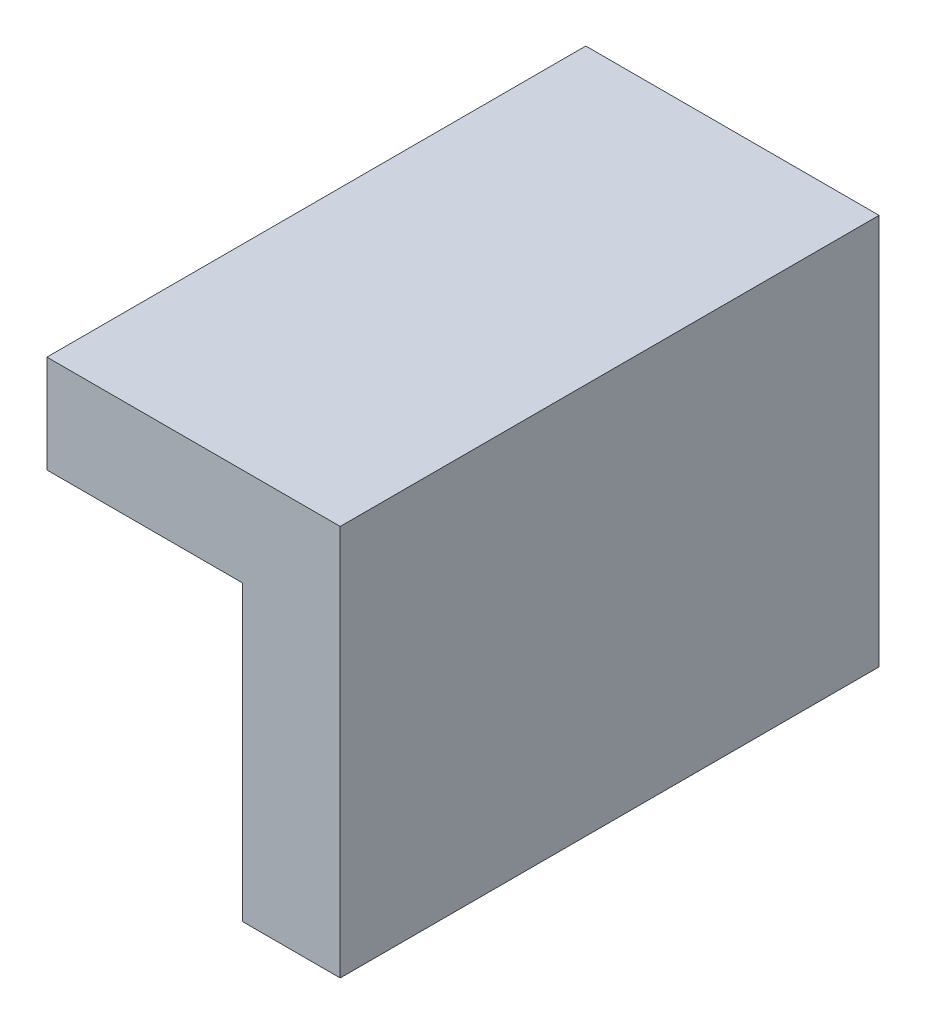
ISO-10303-21;
HEADER;
FILE_DESCRIPTION(('STEP AP214'),'2;1');
FILE_NAME('part.step','',(''),(''),'','','');
FILE_SCHEMA(('AUTOMOTIVE_DESIGN { 1 0 10303 214 1 1 1 1 }'));
ENDSEC;
DATA;
#1=APPLICATION_CONTEXT('core data for automotive mechanical design processes');
#2=APPLICATION_PROTOCOL_DEFINITION('international standard','automotive_design',2000,#1);
#3=PRODUCT_CONTEXT('',#1,'mechanical');
#4=PRODUCT('Part','Part','',(#3));
#5=PRODUCT_RELATED_PRODUCT_CATEGORY('part','',(#4));
#6=PRODUCT_DEFINITION_FORMATION('','',#4);
#7=PRODUCT_DEFINITION_CONTEXT('part definition',#1,'design');
#8=PRODUCT_DEFINITION('design','',#6,#7);
#9=PRODUCT_DEFINITION_SHAPE('','',#8);
#10=(LENGTH_UNIT() NAMED_UNIT(*) SI_UNIT(.MILLI.,.METRE.));
#11=(NAMED_UNIT(*) PLANE_ANGLE_UNIT() SI_UNIT($,.RADIAN.));
#12=(NAMED_UNIT(*) SI_UNIT($,.STERADIAN.) SOLID_ANGLE_UNIT());
#13=UNCERTAINTY_MEASURE_WITH_UNIT(LENGTH_MEASURE(1.E-05),#10,'distance_accuracy_value','');
#14=(GEOMETRIC_REPRESENTATION_CONTEXT(3) GLOBAL_UNCERTAINTY_ASSIGNED_CONTEXT((#13)) GLOBAL_UNIT_ASSIGNED_CONTEXT((#10,
#11,#12)) REPRESENTATION_CONTEXT('',''));
#15=CARTESIAN_POINT('',(0.,0.,0.));
#16=DIRECTION('',(0.,0.,1.));
#17=DIRECTION('',(1.,0.,0.));
#18=AXIS2_PLACEMENT_3D('',#15,#16,#17);
#19=CARTESIAN_POINT('',(55.,-25.4,12.7));
#20=DIRECTION('',(-1.,0.,0.));
#21=DIRECTION('',(0.,-1.,0.));
#22=AXIS2_PLACEMENT_3D('',#19,#20,#21);
#23=PLANE('',#22);
#24=DIRECTION('',(0.,-1.,0.));
#25=VECTOR('',#24,1.);
#26=CARTESIAN_POINT('',(55.,-25.4,0.));
#27=LINE('',#26,#25);
#28=CARTESIAN_POINT('',(55.,194.6,0.));
#29=VERTEX_POINT('',#28);
#30=CARTESIAN_POINT('',(55.,143.8,0.));
#31=VERTEX_POINT('',#30);
#32=EDGE_CURVE('E110',#29,#31,#27,.T.);
#33=ORIENTED_EDGE('',*,*,#32,.T.);
#34=DIRECTION('',(0.,0.,1.));
#35=VECTOR('',#34,1.);
#36=CARTESIAN_POINT('',(55.,143.8,-70.));
#37=LINE('',#36,#35);
#38=CARTESIAN_POINT('',(55.,143.8,-70.));
#39=VERTEX_POINT('',#38);
#40=EDGE_CURVE('E95',#39,#31,#37,.T.);
#41=ORIENTED_EDGE('',*,*,#40,.F.);
#42=DIRECTION('',(0.,-1.,0.));
#43=VECTOR('',#42,1.);
#44=CARTESIAN_POINT('',(55.,0.,-70.));
#45=LINE('',#44,#43);
#46=CARTESIAN_POINT('',(55.,194.6,-70.));
#47=VERTEX_POINT('',#46);
#48=EDGE_CURVE('E134',#47,#39,#45,.T.);
#49=ORIENTED_EDGE('',*,*,#48,.F.);
#50=DIRECTION('',(0.,0.,1.));
#51=VECTOR('',#50,1.);
#52=CARTESIAN_POINT('',(55.,194.6,-12.7));
#53=LINE('',#52,#51);
#54=EDGE_CURVE('E111',#47,#29,#53,.T.);
#55=ORIENTED_EDGE('',*,*,#54,.T.);
#56=EDGE_LOOP('',(#33,#41,#49,#55));
#57=FACE_BOUND('',#56,.T.);
#58=ADVANCED_FACE('F35',(#57),#23,.F.);
#59=CARTESIAN_POINT('',(0.,0.,0.));
#60=DIRECTION('',(0.,0.,1.));
#61=DIRECTION('',(1.,0.,0.));
#62=AXIS2_PLACEMENT_3D('',#59,#60,#61);
#63=PLANE('',#62);
#64=DIRECTION('',(-1.,0.,0.));
#65=VECTOR('',#64,1.);
#66=CARTESIAN_POINT('',(0.,143.8,0.));
#67=LINE('',#66,#65);
#68=CARTESIAN_POINT('',(42.3,143.8,0.));
#69=VERTEX_POINT('',#68);
#70=EDGE_CURVE('E11',#31,#69,#67,.T.);
#71=ORIENTED_EDGE('',*,*,#70,.F.);
#72=ORIENTED_EDGE('',*,*,#32,.F.);
#73=DIRECTION('',(1.,0.,0.));
#74=VECTOR('',#73,1.);
#75=CARTESIAN_POINT('',(55.,194.6,0.));
#76=LINE('',#75,#74);
#77=CARTESIAN_POINT('',(16.9,194.6,0.));
#78=VERTEX_POINT('',#77);
#79=EDGE_CURVE('E49',#78,#29,#76,.T.);
#80=ORIENTED_EDGE('',*,*,#79,.F.);
#81=DIRECTION('',(0.,1.,0.));
#82=VECTOR('',#81,1.);
#83=CARTESIAN_POINT('',(16.9,0.,0.));
#84=LINE('',#83,#82);
#85=CARTESIAN_POINT('',(16.9,181.9,0.));
#86=VERTEX_POINT('',#85);
#87=EDGE_CURVE('E98',#86,#78,#84,.T.);
#88=ORIENTED_EDGE('',*,*,#87,.F.);
#89=DIRECTION('',(-1.,0.,0.));
#90=VECTOR('',#89,1.);
#91=CARTESIAN_POINT('',(0.,181.9,0.));
#92=LINE('',#91,#90);
#93=CARTESIAN_POINT('',(42.3,181.9,0.));
#94=VERTEX_POINT('',#93);
#95=EDGE_CURVE('E113',#94,#86,#92,.T.);
#96=ORIENTED_EDGE('',*,*,#95,.F.);
#97=DIRECTION('',(0.,1.,0.));
#98=VECTOR('',#97,1.);
#99=CARTESIAN_POINT('',(42.3,0.,0.));
#100=LINE('',#99,#98);
#101=EDGE_CURVE('E42',#69,#94,#100,.T.);
#102=ORIENTED_EDGE('',*,*,#101,.F.);
#103=EDGE_LOOP('',(#71,#72,#80,#88,#96,#102));
#104=FACE_BOUND('',#103,.T.);
#105=ADVANCED_FACE('F108',(#104),#63,.T.);
#106=CARTESIAN_POINT('',(55.,194.6,-12.7));
#107=DIRECTION('',(0.,-1.,0.));
#108=DIRECTION('',(0.,0.,-1.));
#109=AXIS2_PLACEMENT_3D('',#106,#107,#108);
#110=PLANE('',#109);
#111=DIRECTION('',(0.,0.,1.));
#112=VECTOR('',#111,1.);
#113=CARTESIAN_POINT('',(16.9,194.6,-70.));
#114=LINE('',#113,#112);
#115=CARTESIAN_POINT('',(16.9,194.6,-70.));
#116=VERTEX_POINT('',#115);
#117=EDGE_CURVE('E86',#116,#78,#114,.T.);
#118=ORIENTED_EDGE('',*,*,#117,.T.);
#119=ORIENTED_EDGE('',*,*,#79,.T.);
#120=ORIENTED_EDGE('',*,*,#54,.F.);
#121=DIRECTION('',(1.,0.,0.));
#122=VECTOR('',#121,1.);
#123=CARTESIAN_POINT('',(0.,194.6,-70.));
#124=LINE('',#123,#122);
#125=EDGE_CURVE('E90',#116,#47,#124,.T.);
#126=ORIENTED_EDGE('',*,*,#125,.F.);
#127=EDGE_LOOP('',(#118,#119,#120,#126));
#128=FACE_BOUND('',#127,.T.);
#129=ADVANCED_FACE('F88',(#128),#110,.F.);
#130=CARTESIAN_POINT('',(42.3,0.,-70.));
#131=DIRECTION('',(-1.,0.,0.));
#132=DIRECTION('',(0.,-1.,0.));
#133=AXIS2_PLACEMENT_3D('',#130,#131,#132);
#134=PLANE('',#133);
#135=DIRECTION('',(0.,0.,1.));
#136=VECTOR('',#135,1.);
#137=CARTESIAN_POINT('',(42.3,143.8,-70.));
#138=LINE('',#137,#136);
#139=CARTESIAN_POINT('',(42.3,143.8,-70.));
#140=VERTEX_POINT('',#139);
#141=EDGE_CURVE('E125',#140,#69,#138,.T.);
#142=ORIENTED_EDGE('',*,*,#141,.T.);
#143=ORIENTED_EDGE('',*,*,#101,.T.);
#144=DIRECTION('',(0.,0.,1.));
#145=VECTOR('',#144,1.);
#146=CARTESIAN_POINT('',(42.3,181.9,-70.));
#147=LINE('',#146,#145);
#148=CARTESIAN_POINT('',(42.3,181.9,-70.));
#149=VERTEX_POINT('',#148);
#150=EDGE_CURVE('E115',#149,#94,#147,.T.);
#151=ORIENTED_EDGE('',*,*,#150,.F.);
#152=DIRECTION('',(0.,-1.,0.));
#153=VECTOR('',#152,1.);
#154=CARTESIAN_POINT('',(42.3,0.,-70.));
#155=LINE('',#154,#153);
#156=EDGE_CURVE('E104',#149,#140,#155,.T.);
#157=ORIENTED_EDGE('',*,*,#156,.T.);
#158=EDGE_LOOP('',(#142,#143,#151,#157));
#159=FACE_BOUND('',#158,.T.);
#160=ADVANCED_FACE('F122',(#159),#134,.T.);
#161=CARTESIAN_POINT('',(0.,181.9,-70.));
#162=DIRECTION('',(0.,1.,0.));
#163=DIRECTION('',(0.,0.,1.));
#164=AXIS2_PLACEMENT_3D('',#161,#162,#163);
#165=PLANE('',#164);
#166=ORIENTED_EDGE('',*,*,#150,.T.);
#167=ORIENTED_EDGE('',*,*,#95,.T.);
#168=DIRECTION('',(0.,0.,1.));
#169=VECTOR('',#168,1.);
#170=CARTESIAN_POINT('',(16.9,181.9,-70.));
#171=LINE('',#170,#169);
#172=CARTESIAN_POINT('',(16.9,181.9,-70.));
#173=VERTEX_POINT('',#172);
#174=EDGE_CURVE('E94',#173,#86,#171,.T.);
#175=ORIENTED_EDGE('',*,*,#174,.F.);
#176=DIRECTION('',(-1.,0.,0.));
#177=VECTOR('',#176,1.);
#178=CARTESIAN_POINT('',(0.,181.9,-70.));
#179=LINE('',#178,#177);
#180=EDGE_CURVE('E128',#149,#173,#179,.T.);
#181=ORIENTED_EDGE('',*,*,#180,.F.);
#182=EDGE_LOOP('',(#166,#167,#175,#181));
#183=FACE_BOUND('',#182,.T.);
#184=ADVANCED_FACE('F127',(#183),#165,.F.);
#185=CARTESIAN_POINT('',(16.9,0.,-70.));
#186=DIRECTION('',(-1.,0.,0.));
#187=DIRECTION('',(0.,0.,1.));
#188=AXIS2_PLACEMENT_3D('',#185,#186,#187);
#189=PLANE('',#188);
#190=ORIENTED_EDGE('',*,*,#174,.T.);
#191=ORIENTED_EDGE('',*,*,#87,.T.);
#192=ORIENTED_EDGE('',*,*,#117,.F.);
#193=DIRECTION('',(0.,-1.,0.));
#194=VECTOR('',#193,1.);
#195=CARTESIAN_POINT('',(16.9,0.,-70.));
#196=LINE('',#195,#194);
#197=EDGE_CURVE('E137',#116,#173,#196,.T.);
#198=ORIENTED_EDGE('',*,*,#197,.T.);
#199=EDGE_LOOP('',(#190,#191,#192,#198));
#200=FACE_BOUND('',#199,.T.);
#201=ADVANCED_FACE('F99',(#200),#189,.T.);
#202=CARTESIAN_POINT('',(0.,143.8,-70.));
#203=DIRECTION('',(0.,1.,0.));
#204=DIRECTION('',(0.,0.,1.));
#205=AXIS2_PLACEMENT_3D('',#202,#203,#204);
#206=PLANE('',#205);
#207=ORIENTED_EDGE('',*,*,#40,.T.);
#208=ORIENTED_EDGE('',*,*,#70,.T.);
#209=ORIENTED_EDGE('',*,*,#141,.F.);
#210=DIRECTION('',(-1.,0.,0.));
#211=VECTOR('',#210,1.);
#212=CARTESIAN_POINT('',(0.,143.8,-70.));
#213=LINE('',#212,#211);
#214=EDGE_CURVE('E57',#39,#140,#213,.T.);
#215=ORIENTED_EDGE('',*,*,#214,.F.);
#216=EDGE_LOOP('',(#207,#208,#209,#215));
#217=FACE_BOUND('',#216,.T.);
#218=ADVANCED_FACE('F145',(#217),#206,.F.);
#219=CARTESIAN_POINT('',(0.,0.,-70.));
#220=DIRECTION('',(0.,0.,-1.));
#221=DIRECTION('',(-1.,0.,0.));
#222=AXIS2_PLACEMENT_3D('',#219,#220,#221);
#223=PLANE('',#222);
#224=ORIENTED_EDGE('',*,*,#156,.F.);
#225=ORIENTED_EDGE('',*,*,#180,.T.);
#226=ORIENTED_EDGE('',*,*,#197,.F.);
#227=ORIENTED_EDGE('',*,*,#125,.T.);
#228=ORIENTED_EDGE('',*,*,#48,.T.);
#229=ORIENTED_EDGE('',*,*,#214,.T.);
#230=EDGE_LOOP('',(#224,#225,#226,#227,#228,#229));
#231=FACE_BOUND('',#230,.T.);
#232=ADVANCED_FACE('F140',(#231),#223,.T.);
#233=CLOSED_SHELL('',(#58,#105,#129,#160,#184,#201,#218,#232));
#234=MANIFOLD_SOLID_BREP('B2',#233);
#235=ADVANCED_BREP_SHAPE_REPRESENTATION('',(#18,#234),#14);
#236=SHAPE_DEFINITION_REPRESENTATION(#9,#235);
ENDSEC;
END-ISO-10303-21;
